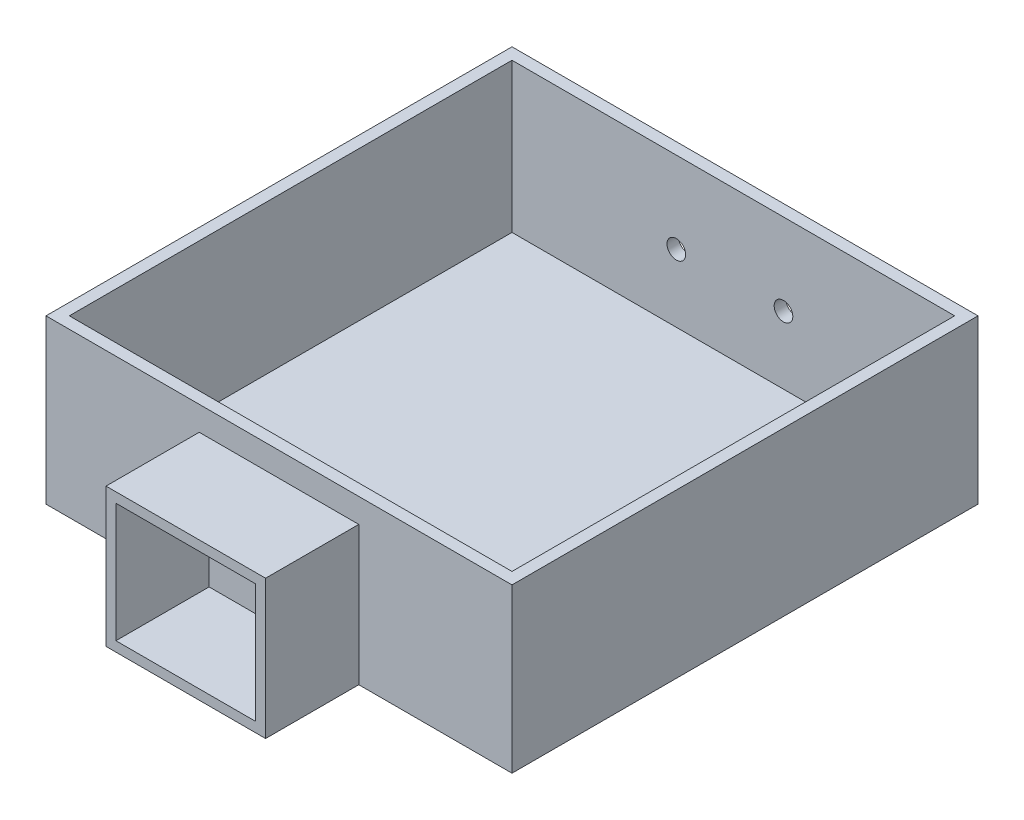
ISO-10303-21;
HEADER;
FILE_DESCRIPTION(('STEP AP214'),'2;1');
FILE_NAME('part.step','',(''),(''),'','','');
FILE_SCHEMA(('AUTOMOTIVE_DESIGN { 1 0 10303 214 1 1 1 1 }'));
ENDSEC;
DATA;
#1=APPLICATION_CONTEXT('core data for automotive mechanical design processes');
#2=APPLICATION_PROTOCOL_DEFINITION('international standard','automotive_design',2000,#1);
#3=PRODUCT_CONTEXT('',#1,'mechanical');
#4=PRODUCT('Part','Part','',(#3));
#5=PRODUCT_RELATED_PRODUCT_CATEGORY('part','',(#4));
#6=PRODUCT_DEFINITION_FORMATION('','',#4);
#7=PRODUCT_DEFINITION_CONTEXT('part definition',#1,'design');
#8=PRODUCT_DEFINITION('design','',#6,#7);
#9=PRODUCT_DEFINITION_SHAPE('','',#8);
#10=(LENGTH_UNIT() NAMED_UNIT(*) SI_UNIT(.MILLI.,.METRE.));
#11=(NAMED_UNIT(*) PLANE_ANGLE_UNIT() SI_UNIT($,.RADIAN.));
#12=(NAMED_UNIT(*) SI_UNIT($,.STERADIAN.) SOLID_ANGLE_UNIT());
#13=UNCERTAINTY_MEASURE_WITH_UNIT(LENGTH_MEASURE(1.E-05),#10,'distance_accuracy_value','');
#14=(GEOMETRIC_REPRESENTATION_CONTEXT(3) GLOBAL_UNCERTAINTY_ASSIGNED_CONTEXT((#13)) GLOBAL_UNIT_ASSIGNED_CONTEXT((#10,
#11,#12)) REPRESENTATION_CONTEXT('',''));
#15=CARTESIAN_POINT('',(0.,0.,0.));
#16=DIRECTION('',(0.,0.,1.));
#17=DIRECTION('',(1.,0.,0.));
#18=AXIS2_PLACEMENT_3D('',#15,#16,#17);
#19=CARTESIAN_POINT('',(-50.,35.,50.));
#20=DIRECTION('',(0.,0.,-1.));
#21=DIRECTION('',(-1.,0.,0.));
#22=AXIS2_PLACEMENT_3D('',#19,#20,#21);
#23=PLANE('',#22);
#24=DIRECTION('',(0.,1.,0.));
#25=VECTOR('',#24,1.);
#26=CARTESIAN_POINT('',(17.118009842931,0.,50.));
#27=LINE('',#26,#25);
#28=CARTESIAN_POINT('',(17.118009842931,0.,50.));
#29=VERTEX_POINT('',#28);
#30=CARTESIAN_POINT('',(17.118009842931,29.8003663542023,50.));
#31=VERTEX_POINT('',#30);
#32=EDGE_CURVE('E219',#29,#31,#27,.T.);
#33=ORIENTED_EDGE('',*,*,#32,.F.);
#34=DIRECTION('',(1.,0.,0.));
#35=VECTOR('',#34,1.);
#36=CARTESIAN_POINT('',(-50.,0.,50.));
#37=LINE('',#36,#35);
#38=CARTESIAN_POINT('',(50.,0.,50.));
#39=VERTEX_POINT('',#38);
#40=EDGE_CURVE('E335',#29,#39,#37,.T.);
#41=ORIENTED_EDGE('',*,*,#40,.T.);
#42=DIRECTION('',(0.,-1.,0.));
#43=VECTOR('',#42,1.);
#44=CARTESIAN_POINT('',(50.,35.,50.));
#45=LINE('',#44,#43);
#46=CARTESIAN_POINT('',(50.,35.,50.));
#47=VERTEX_POINT('',#46);
#48=EDGE_CURVE('E325',#47,#39,#45,.T.);
#49=ORIENTED_EDGE('',*,*,#48,.F.);
#50=DIRECTION('',(1.,0.,0.));
#51=VECTOR('',#50,1.);
#52=CARTESIAN_POINT('',(-50.,35.,50.));
#53=LINE('',#52,#51);
#54=CARTESIAN_POINT('',(-50.,35.,50.));
#55=VERTEX_POINT('',#54);
#56=EDGE_CURVE('E322',#55,#47,#53,.T.);
#57=ORIENTED_EDGE('',*,*,#56,.F.);
#58=DIRECTION('',(0.,-1.,0.));
#59=VECTOR('',#58,1.);
#60=CARTESIAN_POINT('',(-50.,35.,50.));
#61=LINE('',#60,#59);
#62=CARTESIAN_POINT('',(-50.,0.,50.));
#63=VERTEX_POINT('',#62);
#64=EDGE_CURVE('E341',#55,#63,#61,.T.);
#65=ORIENTED_EDGE('',*,*,#64,.T.);
#66=CARTESIAN_POINT('',(-17.118009842931,0.,50.));
#67=VERTEX_POINT('',#66);
#68=EDGE_CURVE('E316',#63,#67,#37,.T.);
#69=ORIENTED_EDGE('',*,*,#68,.T.);
#70=DIRECTION('',(0.,-1.,0.));
#71=VECTOR('',#70,1.);
#72=CARTESIAN_POINT('',(-17.118009842931,5.19963364579772,50.));
#73=LINE('',#72,#71);
#74=CARTESIAN_POINT('',(-17.118009842931,29.8003663542023,50.));
#75=VERTEX_POINT('',#74);
#76=EDGE_CURVE('E232',#75,#67,#73,.T.);
#77=ORIENTED_EDGE('',*,*,#76,.F.);
#78=DIRECTION('',(-1.,0.,0.));
#79=VECTOR('',#78,1.);
#80=CARTESIAN_POINT('',(-17.118009842931,29.8003663542023,50.));
#81=LINE('',#80,#79);
#82=EDGE_CURVE('E71',#31,#75,#81,.T.);
#83=ORIENTED_EDGE('',*,*,#82,.F.);
#84=EDGE_LOOP('',(#33,#41,#49,#57,#65,#69,#77,#83));
#85=FACE_BOUND('',#84,.T.);
#86=ADVANCED_FACE('F45',(#85),#23,.F.);
#87=CARTESIAN_POINT('',(50.,35.,50.));
#88=DIRECTION('',(-1.,0.,0.));
#89=DIRECTION('',(0.,0.,1.));
#90=AXIS2_PLACEMENT_3D('',#87,#88,#89);
#91=PLANE('',#90);
#92=DIRECTION('',(0.,0.,-1.));
#93=VECTOR('',#92,1.);
#94=CARTESIAN_POINT('',(50.,0.,50.));
#95=LINE('',#94,#93);
#96=CARTESIAN_POINT('',(50.,0.,-50.));
#97=VERTEX_POINT('',#96);
#98=EDGE_CURVE('E301',#39,#97,#95,.T.);
#99=ORIENTED_EDGE('',*,*,#98,.T.);
#100=DIRECTION('',(0.,-1.,0.));
#101=VECTOR('',#100,1.);
#102=CARTESIAN_POINT('',(50.,35.,-50.));
#103=LINE('',#102,#101);
#104=CARTESIAN_POINT('',(50.,35.,-50.));
#105=VERTEX_POINT('',#104);
#106=EDGE_CURVE('E11',#105,#97,#103,.T.);
#107=ORIENTED_EDGE('',*,*,#106,.F.);
#108=DIRECTION('',(0.,0.,-1.));
#109=VECTOR('',#108,1.);
#110=CARTESIAN_POINT('',(50.,35.,50.));
#111=LINE('',#110,#109);
#112=EDGE_CURVE('E311',#47,#105,#111,.T.);
#113=ORIENTED_EDGE('',*,*,#112,.F.);
#114=ORIENTED_EDGE('',*,*,#48,.T.);
#115=EDGE_LOOP('',(#99,#107,#113,#114));
#116=FACE_BOUND('',#115,.T.);
#117=ADVANCED_FACE('F47',(#116),#91,.F.);
#118=CARTESIAN_POINT('',(-50.,35.,-50.));
#119=DIRECTION('',(0.,0.,1.));
#120=DIRECTION('',(1.,0.,0.));
#121=AXIS2_PLACEMENT_3D('',#118,#119,#120);
#122=PLANE('',#121);
#123=CARTESIAN_POINT('',(10.7628205599326,17.5,-50.));
#124=DIRECTION('',(0.,0.,-1.));
#125=DIRECTION('',(-1.,0.,0.));
#126=AXIS2_PLACEMENT_3D('',#123,#124,#125);
#127=CIRCLE('',#126,2.);
#128=CARTESIAN_POINT('',(8.76282055993261,17.5,-50.));
#129=VERTEX_POINT('',#128);
#130=EDGE_CURVE('E254',#129,#129,#127,.T.);
#131=ORIENTED_EDGE('',*,*,#130,.F.);
#132=EDGE_LOOP('',(#131));
#133=FACE_BOUND('',#132,.T.);
#134=CARTESIAN_POINT('',(-12.2371794400674,17.5,-50.));
#135=DIRECTION('',(0.,0.,-1.));
#136=DIRECTION('',(-1.,0.,0.));
#137=AXIS2_PLACEMENT_3D('',#134,#135,#136);
#138=CIRCLE('',#137,2.);
#139=CARTESIAN_POINT('',(-14.2371794400674,17.5,-50.));
#140=VERTEX_POINT('',#139);
#141=EDGE_CURVE('E253',#140,#140,#138,.T.);
#142=ORIENTED_EDGE('',*,*,#141,.F.);
#143=EDGE_LOOP('',(#142));
#144=FACE_BOUND('',#143,.T.);
#145=DIRECTION('',(-1.,0.,0.));
#146=VECTOR('',#145,1.);
#147=CARTESIAN_POINT('',(-50.,0.,-50.));
#148=LINE('',#147,#146);
#149=CARTESIAN_POINT('',(-50.,0.,-50.));
#150=VERTEX_POINT('',#149);
#151=EDGE_CURVE('E329',#97,#150,#148,.T.);
#152=ORIENTED_EDGE('',*,*,#151,.T.);
#153=DIRECTION('',(0.,-1.,0.));
#154=VECTOR('',#153,1.);
#155=CARTESIAN_POINT('',(-50.,35.,-50.));
#156=LINE('',#155,#154);
#157=CARTESIAN_POINT('',(-50.,35.,-50.));
#158=VERTEX_POINT('',#157);
#159=EDGE_CURVE('E55',#158,#150,#156,.T.);
#160=ORIENTED_EDGE('',*,*,#159,.F.);
#161=DIRECTION('',(-1.,0.,0.));
#162=VECTOR('',#161,1.);
#163=CARTESIAN_POINT('',(-50.,35.,-50.));
#164=LINE('',#163,#162);
#165=EDGE_CURVE('E315',#105,#158,#164,.T.);
#166=ORIENTED_EDGE('',*,*,#165,.F.);
#167=ORIENTED_EDGE('',*,*,#106,.T.);
#168=EDGE_LOOP('',(#152,#160,#166,#167));
#169=FACE_BOUND('',#168,.T.);
#170=ADVANCED_FACE('F381',(#133,#144,#169),#122,.F.);
#171=CARTESIAN_POINT('',(-50.,35.,50.));
#172=DIRECTION('',(1.,0.,0.));
#173=DIRECTION('',(0.,0.,-1.));
#174=AXIS2_PLACEMENT_3D('',#171,#172,#173);
#175=PLANE('',#174);
#176=DIRECTION('',(0.,0.,1.));
#177=VECTOR('',#176,1.);
#178=CARTESIAN_POINT('',(-50.,0.,50.));
#179=LINE('',#178,#177);
#180=EDGE_CURVE('E332',#150,#63,#179,.T.);
#181=ORIENTED_EDGE('',*,*,#180,.T.);
#182=ORIENTED_EDGE('',*,*,#64,.F.);
#183=DIRECTION('',(0.,0.,1.));
#184=VECTOR('',#183,1.);
#185=CARTESIAN_POINT('',(-50.,35.,50.));
#186=LINE('',#185,#184);
#187=EDGE_CURVE('E319',#158,#55,#186,.T.);
#188=ORIENTED_EDGE('',*,*,#187,.F.);
#189=ORIENTED_EDGE('',*,*,#159,.T.);
#190=EDGE_LOOP('',(#181,#182,#188,#189));
#191=FACE_BOUND('',#190,.T.);
#192=ADVANCED_FACE('F387',(#191),#175,.F.);
#193=CARTESIAN_POINT('',(0.,35.,0.));
#194=DIRECTION('',(0.,-1.,0.));
#195=DIRECTION('',(0.,0.,-1.));
#196=AXIS2_PLACEMENT_3D('',#193,#194,#195);
#197=PLANE('',#196);
#198=DIRECTION('',(-1.,0.,0.));
#199=VECTOR('',#198,1.);
#200=CARTESIAN_POINT('',(-47.5,35.,-47.5));
#201=LINE('',#200,#199);
#202=CARTESIAN_POINT('',(47.5,35.,-47.5));
#203=VERTEX_POINT('',#202);
#204=CARTESIAN_POINT('',(-47.5,35.,-47.5));
#205=VERTEX_POINT('',#204);
#206=EDGE_CURVE('E286',#203,#205,#201,.T.);
#207=ORIENTED_EDGE('',*,*,#206,.F.);
#208=DIRECTION('',(0.,0.,-1.));
#209=VECTOR('',#208,1.);
#210=CARTESIAN_POINT('',(47.5,35.,47.5));
#211=LINE('',#210,#209);
#212=CARTESIAN_POINT('',(47.5,35.,47.5));
#213=VERTEX_POINT('',#212);
#214=EDGE_CURVE('E283',#213,#203,#211,.T.);
#215=ORIENTED_EDGE('',*,*,#214,.F.);
#216=DIRECTION('',(1.,0.,0.));
#217=VECTOR('',#216,1.);
#218=CARTESIAN_POINT('',(-47.5,35.,47.5));
#219=LINE('',#218,#217);
#220=CARTESIAN_POINT('',(-47.5,35.,47.5));
#221=VERTEX_POINT('',#220);
#222=EDGE_CURVE('E270',#221,#213,#219,.T.);
#223=ORIENTED_EDGE('',*,*,#222,.F.);
#224=DIRECTION('',(0.,0.,1.));
#225=VECTOR('',#224,1.);
#226=CARTESIAN_POINT('',(-47.5,35.,47.5));
#227=LINE('',#226,#225);
#228=EDGE_CURVE('E291',#205,#221,#227,.T.);
#229=ORIENTED_EDGE('',*,*,#228,.F.);
#230=EDGE_LOOP('',(#207,#215,#223,#229));
#231=FACE_BOUND('',#230,.T.);
#232=ORIENTED_EDGE('',*,*,#112,.T.);
#233=ORIENTED_EDGE('',*,*,#165,.T.);
#234=ORIENTED_EDGE('',*,*,#187,.T.);
#235=ORIENTED_EDGE('',*,*,#56,.T.);
#236=EDGE_LOOP('',(#232,#233,#234,#235));
#237=FACE_BOUND('',#236,.T.);
#238=ADVANCED_FACE('F389',(#231,#237),#197,.F.);
#239=CARTESIAN_POINT('',(0.,0.,0.));
#240=DIRECTION('',(0.,-1.,0.));
#241=DIRECTION('',(0.,0.,-1.));
#242=AXIS2_PLACEMENT_3D('',#239,#240,#241);
#243=PLANE('',#242);
#244=ORIENTED_EDGE('',*,*,#98,.F.);
#245=ORIENTED_EDGE('',*,*,#40,.F.);
#246=DIRECTION('',(0.,0.,-1.));
#247=VECTOR('',#246,1.);
#248=CARTESIAN_POINT('',(17.118009842931,0.,70.));
#249=LINE('',#248,#247);
#250=CARTESIAN_POINT('',(17.118009842931,0.,70.));
#251=VERTEX_POINT('',#250);
#252=EDGE_CURVE('E229',#251,#29,#249,.T.);
#253=ORIENTED_EDGE('',*,*,#252,.F.);
#254=DIRECTION('',(1.,0.,0.));
#255=VECTOR('',#254,1.);
#256=CARTESIAN_POINT('',(-17.118009842931,0.,70.));
#257=LINE('',#256,#255);
#258=CARTESIAN_POINT('',(-17.118009842931,0.,70.));
#259=VERTEX_POINT('',#258);
#260=EDGE_CURVE('E225',#259,#251,#257,.T.);
#261=ORIENTED_EDGE('',*,*,#260,.F.);
#262=DIRECTION('',(0.,0.,-1.));
#263=VECTOR('',#262,1.);
#264=CARTESIAN_POINT('',(-17.118009842931,0.,70.));
#265=LINE('',#264,#263);
#266=EDGE_CURVE('E241',#259,#67,#265,.T.);
#267=ORIENTED_EDGE('',*,*,#266,.T.);
#268=ORIENTED_EDGE('',*,*,#68,.F.);
#269=ORIENTED_EDGE('',*,*,#180,.F.);
#270=ORIENTED_EDGE('',*,*,#151,.F.);
#271=EDGE_LOOP('',(#244,#245,#253,#261,#267,#268,#269,#270));
#272=FACE_BOUND('',#271,.T.);
#273=ADVANCED_FACE('F385',(#272),#243,.T.);
#274=CARTESIAN_POINT('',(47.5,3.,47.5));
#275=DIRECTION('',(1.,0.,0.));
#276=DIRECTION('',(0.,0.,-1.));
#277=AXIS2_PLACEMENT_3D('',#274,#275,#276);
#278=PLANE('',#277);
#279=ORIENTED_EDGE('',*,*,#214,.T.);
#280=DIRECTION('',(0.,1.,0.));
#281=VECTOR('',#280,1.);
#282=CARTESIAN_POINT('',(47.5,3.,-47.5));
#283=LINE('',#282,#281);
#284=CARTESIAN_POINT('',(47.5,3.,-47.5));
#285=VERTEX_POINT('',#284);
#286=EDGE_CURVE('E282',#285,#203,#283,.T.);
#287=ORIENTED_EDGE('',*,*,#286,.F.);
#288=DIRECTION('',(0.,0.,-1.));
#289=VECTOR('',#288,1.);
#290=CARTESIAN_POINT('',(47.5,3.,47.5));
#291=LINE('',#290,#289);
#292=CARTESIAN_POINT('',(47.5,3.,47.5));
#293=VERTEX_POINT('',#292);
#294=EDGE_CURVE('E265',#293,#285,#291,.T.);
#295=ORIENTED_EDGE('',*,*,#294,.F.);
#296=DIRECTION('',(0.,1.,0.));
#297=VECTOR('',#296,1.);
#298=CARTESIAN_POINT('',(47.5,3.,47.5));
#299=LINE('',#298,#297);
#300=EDGE_CURVE('E298',#293,#213,#299,.T.);
#301=ORIENTED_EDGE('',*,*,#300,.T.);
#302=EDGE_LOOP('',(#279,#287,#295,#301));
#303=FACE_BOUND('',#302,.T.);
#304=ADVANCED_FACE('F431',(#303),#278,.F.);
#305=CARTESIAN_POINT('',(-47.5,3.,47.5));
#306=DIRECTION('',(0.,0.,1.));
#307=DIRECTION('',(1.,0.,0.));
#308=AXIS2_PLACEMENT_3D('',#305,#306,#307);
#309=PLANE('',#308);
#310=CARTESIAN_POINT('',(0.,17.5,47.5));
#311=DIRECTION('',(0.,0.,1.));
#312=DIRECTION('',(1.,0.,0.));
#313=AXIS2_PLACEMENT_3D('',#310,#311,#312);
#314=CIRCLE('',#313,10.);
#315=CARTESIAN_POINT('',(-10.,17.5,47.5));
#316=VERTEX_POINT('',#315);
#317=EDGE_CURVE('E287',#316,#316,#314,.F.);
#318=ORIENTED_EDGE('',*,*,#317,.F.);
#319=EDGE_LOOP('',(#318));
#320=FACE_BOUND('',#319,.T.);
#321=ORIENTED_EDGE('',*,*,#222,.T.);
#322=ORIENTED_EDGE('',*,*,#300,.F.);
#323=DIRECTION('',(1.,0.,0.));
#324=VECTOR('',#323,1.);
#325=CARTESIAN_POINT('',(-47.5,3.,47.5));
#326=LINE('',#325,#324);
#327=CARTESIAN_POINT('',(-47.5,3.,47.5));
#328=VERTEX_POINT('',#327);
#329=EDGE_CURVE('E278',#328,#293,#326,.T.);
#330=ORIENTED_EDGE('',*,*,#329,.F.);
#331=DIRECTION('',(0.,1.,0.));
#332=VECTOR('',#331,1.);
#333=CARTESIAN_POINT('',(-47.5,3.,47.5));
#334=LINE('',#333,#332);
#335=EDGE_CURVE('E302',#328,#221,#334,.T.);
#336=ORIENTED_EDGE('',*,*,#335,.T.);
#337=EDGE_LOOP('',(#321,#322,#330,#336));
#338=FACE_BOUND('',#337,.T.);
#339=ADVANCED_FACE('F435',(#320,#338),#309,.F.);
#340=CARTESIAN_POINT('',(-47.5,3.,47.5));
#341=DIRECTION('',(-1.,0.,0.));
#342=DIRECTION('',(0.,0.,1.));
#343=AXIS2_PLACEMENT_3D('',#340,#341,#342);
#344=PLANE('',#343);
#345=ORIENTED_EDGE('',*,*,#228,.T.);
#346=ORIENTED_EDGE('',*,*,#335,.F.);
#347=DIRECTION('',(0.,0.,1.));
#348=VECTOR('',#347,1.);
#349=CARTESIAN_POINT('',(-47.5,3.,47.5));
#350=LINE('',#349,#348);
#351=CARTESIAN_POINT('',(-47.5,3.,-47.5));
#352=VERTEX_POINT('',#351);
#353=EDGE_CURVE('E274',#352,#328,#350,.T.);
#354=ORIENTED_EDGE('',*,*,#353,.F.);
#355=DIRECTION('',(0.,1.,0.));
#356=VECTOR('',#355,1.);
#357=CARTESIAN_POINT('',(-47.5,3.,-47.5));
#358=LINE('',#357,#356);
#359=EDGE_CURVE('E305',#352,#205,#358,.T.);
#360=ORIENTED_EDGE('',*,*,#359,.T.);
#361=EDGE_LOOP('',(#345,#346,#354,#360));
#362=FACE_BOUND('',#361,.T.);
#363=ADVANCED_FACE('F439',(#362),#344,.F.);
#364=CARTESIAN_POINT('',(-47.5,3.,-47.5));
#365=DIRECTION('',(0.,0.,-1.));
#366=DIRECTION('',(-1.,0.,0.));
#367=AXIS2_PLACEMENT_3D('',#364,#365,#366);
#368=PLANE('',#367);
#369=CARTESIAN_POINT('',(10.7628205599326,17.5,-47.5));
#370=DIRECTION('',(0.,0.,-1.));
#371=DIRECTION('',(-1.,0.,0.));
#372=AXIS2_PLACEMENT_3D('',#369,#370,#371);
#373=CIRCLE('',#372,2.);
#374=CARTESIAN_POINT('',(8.76282055993261,17.5,-47.5));
#375=VERTEX_POINT('',#374);
#376=EDGE_CURVE('E49',#375,#375,#373,.T.);
#377=ORIENTED_EDGE('',*,*,#376,.T.);
#378=EDGE_LOOP('',(#377));
#379=FACE_BOUND('',#378,.T.);
#380=CARTESIAN_POINT('',(-12.2371794400674,17.5,-47.5));
#381=DIRECTION('',(0.,0.,-1.));
#382=DIRECTION('',(-1.,0.,0.));
#383=AXIS2_PLACEMENT_3D('',#380,#381,#382);
#384=CIRCLE('',#383,2.);
#385=CARTESIAN_POINT('',(-14.2371794400674,17.5,-47.5));
#386=VERTEX_POINT('',#385);
#387=EDGE_CURVE('E258',#386,#386,#384,.T.);
#388=ORIENTED_EDGE('',*,*,#387,.T.);
#389=EDGE_LOOP('',(#388));
#390=FACE_BOUND('',#389,.T.);
#391=ORIENTED_EDGE('',*,*,#206,.T.);
#392=ORIENTED_EDGE('',*,*,#359,.F.);
#393=DIRECTION('',(-1.,0.,0.));
#394=VECTOR('',#393,1.);
#395=CARTESIAN_POINT('',(-47.5,3.,-47.5));
#396=LINE('',#395,#394);
#397=EDGE_CURVE('E269',#285,#352,#396,.T.);
#398=ORIENTED_EDGE('',*,*,#397,.F.);
#399=ORIENTED_EDGE('',*,*,#286,.T.);
#400=EDGE_LOOP('',(#391,#392,#398,#399));
#401=FACE_BOUND('',#400,.T.);
#402=ADVANCED_FACE('F358',(#379,#390,#401),#368,.F.);
#403=CARTESIAN_POINT('',(0.,3.,0.));
#404=DIRECTION('',(0.,-1.,0.));
#405=DIRECTION('',(0.,0.,-1.));
#406=AXIS2_PLACEMENT_3D('',#403,#404,#405);
#407=PLANE('',#406);
#408=ORIENTED_EDGE('',*,*,#294,.T.);
#409=ORIENTED_EDGE('',*,*,#397,.T.);
#410=ORIENTED_EDGE('',*,*,#353,.T.);
#411=ORIENTED_EDGE('',*,*,#329,.T.);
#412=EDGE_LOOP('',(#408,#409,#410,#411));
#413=FACE_BOUND('',#412,.T.);
#414=ADVANCED_FACE('F438',(#413),#407,.F.);
#415=CARTESIAN_POINT('',(0.,17.5,50.000012));
#416=DIRECTION('',(0.,0.,-1.));
#417=DIRECTION('',(-1.,0.,0.));
#418=AXIS2_PLACEMENT_3D('',#415,#416,#417);
#419=CYLINDRICAL_SURFACE('',#418,10.);
#420=CARTESIAN_POINT('',(0.,17.5,50.));
#421=DIRECTION('',(0.,0.,-1.));
#422=DIRECTION('',(-1.,0.,0.));
#423=AXIS2_PLACEMENT_3D('',#420,#421,#422);
#424=CIRCLE('',#423,10.);
#425=CARTESIAN_POINT('',(-10.,17.5,50.));
#426=VERTEX_POINT('',#425);
#427=EDGE_CURVE('E208',#426,#426,#424,.F.);
#428=CARTESIAN_POINT('',(-10.,17.5,47.5));
#429=CARTESIAN_POINT('',(-10.,17.5,47.5260416666667));
#430=CARTESIAN_POINT('',(-10.,17.5,47.5520833333333));
#431=CARTESIAN_POINT('',(-10.,17.5,47.6041666666667));
#432=CARTESIAN_POINT('',(-10.,17.5,47.6302083333333));
#433=CARTESIAN_POINT('',(-10.,17.5,47.6822916666667));
#434=CARTESIAN_POINT('',(-10.,17.5,47.7083333333333));
#435=CARTESIAN_POINT('',(-10.,17.5,47.7604166666667));
#436=CARTESIAN_POINT('',(-10.,17.5,47.7864583333333));
#437=CARTESIAN_POINT('',(-10.,17.5,47.8385416666667));
#438=CARTESIAN_POINT('',(-10.,17.5,47.8645833333333));
#439=CARTESIAN_POINT('',(-10.,17.5,47.9166666666667));
#440=CARTESIAN_POINT('',(-10.,17.5,47.9427083333333));
#441=CARTESIAN_POINT('',(-10.,17.5,47.9947916666667));
#442=CARTESIAN_POINT('',(-10.,17.5,48.0208333333333));
#443=CARTESIAN_POINT('',(-10.,17.5,48.0729166666667));
#444=CARTESIAN_POINT('',(-10.,17.5,48.0989583333333));
#445=CARTESIAN_POINT('',(-10.,17.5,48.1510416666667));
#446=CARTESIAN_POINT('',(-10.,17.5,48.1770833333333));
#447=CARTESIAN_POINT('',(-10.,17.5,48.2291666666667));
#448=CARTESIAN_POINT('',(-10.,17.5,48.2552083333333));
#449=CARTESIAN_POINT('',(-10.,17.5,48.3072916666667));
#450=CARTESIAN_POINT('',(-10.,17.5,48.3333333333333));
#451=CARTESIAN_POINT('',(-10.,17.5,48.3854166666667));
#452=CARTESIAN_POINT('',(-10.,17.5,48.4114583333333));
#453=CARTESIAN_POINT('',(-10.,17.5,48.4635416666667));
#454=CARTESIAN_POINT('',(-10.,17.5,48.4895833333333));
#455=CARTESIAN_POINT('',(-10.,17.5,48.5416666666667));
#456=CARTESIAN_POINT('',(-10.,17.5,48.5677083333333));
#457=CARTESIAN_POINT('',(-10.,17.5,48.6197916666667));
#458=CARTESIAN_POINT('',(-10.,17.5,48.6458333333333));
#459=CARTESIAN_POINT('',(-10.,17.5,48.6979166666667));
#460=CARTESIAN_POINT('',(-10.,17.5,48.7239583333333));
#461=CARTESIAN_POINT('',(-10.,17.5,48.7760416666667));
#462=CARTESIAN_POINT('',(-10.,17.5,48.8020833333333));
#463=CARTESIAN_POINT('',(-10.,17.5,48.8541666666667));
#464=CARTESIAN_POINT('',(-10.,17.5,48.8802083333333));
#465=CARTESIAN_POINT('',(-10.,17.5,48.9322916666667));
#466=CARTESIAN_POINT('',(-10.,17.5,48.9583333333333));
#467=CARTESIAN_POINT('',(-10.,17.5,49.0104166666667));
#468=CARTESIAN_POINT('',(-10.,17.5,49.0364583333333));
#469=CARTESIAN_POINT('',(-10.,17.5,49.0885416666667));
#470=CARTESIAN_POINT('',(-10.,17.5,49.1145833333333));
#471=CARTESIAN_POINT('',(-10.,17.5,49.1666666666667));
#472=CARTESIAN_POINT('',(-10.,17.5,49.1927083333333));
#473=CARTESIAN_POINT('',(-10.,17.5,49.2447916666667));
#474=CARTESIAN_POINT('',(-10.,17.5,49.2708333333333));
#475=CARTESIAN_POINT('',(-10.,17.5,49.3229166666667));
#476=CARTESIAN_POINT('',(-10.,17.5,49.3489583333333));
#477=CARTESIAN_POINT('',(-10.,17.5,49.4010416666667));
#478=CARTESIAN_POINT('',(-10.,17.5,49.4270833333333));
#479=CARTESIAN_POINT('',(-10.,17.5,49.4791666666667));
#480=CARTESIAN_POINT('',(-10.,17.5,49.5052083333333));
#481=CARTESIAN_POINT('',(-10.,17.5,49.5572916666667));
#482=CARTESIAN_POINT('',(-10.,17.5,49.5833333333333));
#483=CARTESIAN_POINT('',(-10.,17.5,49.6354166666667));
#484=CARTESIAN_POINT('',(-10.,17.5,49.6614583333333));
#485=CARTESIAN_POINT('',(-10.,17.5,49.7135416666667));
#486=CARTESIAN_POINT('',(-10.,17.5,49.7395833333333));
#487=CARTESIAN_POINT('',(-10.,17.5,49.7916666666667));
#488=CARTESIAN_POINT('',(-10.,17.5,49.8177083333333));
#489=CARTESIAN_POINT('',(-10.,17.5,49.8697916666667));
#490=CARTESIAN_POINT('',(-10.,17.5,49.8958333333333));
#491=CARTESIAN_POINT('',(-10.,17.5,49.9479166666667));
#492=CARTESIAN_POINT('',(-10.,17.5,49.9739583333333));
#493=CARTESIAN_POINT('',(-10.,17.5,50.));
#494=B_SPLINE_CURVE_WITH_KNOTS('',3,(#428,#429,#430,#431,#432,#433,#434,#435,#436,#437,#438,
#439,#440,#441,#442,#443,#444,#445,#446,#447,#448,#449,#450,#451,#452,#453,#454,#455,#456,#457,
#458,#459,#460,#461,#462,#463,#464,#465,#466,#467,#468,#469,#470,#471,#472,#473,#474,#475,#476,
#477,#478,#479,#480,#481,#482,#483,#484,#485,#486,#487,#488,#489,#490,#491,#492,#493),
.UNSPECIFIED.,.F.,.F.,(4,2,2,2,2,2,2,2,2,2,2,2,2,2,2,2,2,2,2,2,2,2,2,2,2,2,2,2,2,2,2,2,4),(0.,
0.0781250000000053,0.156250000000004,0.234375000000002,0.3125,0.390625000000006,
0.468750000000004,0.546875000000002,0.625000000000001,0.703125000000006,0.781250000000004,
0.859375000000002,0.937500000000001,1.01562500000001,1.09375,1.171875,1.25,1.32812500000001,
1.40625,1.484375,1.5625,1.64062500000001,1.71875,1.796875,1.875,1.95312500000001,
2.03125000000001,2.109375,2.18750000000001,2.26562500000001,2.34375000000001,2.421875,
2.50000000000001),.UNSPECIFIED.);
#495=EDGE_CURVE('BSEAM372',#316,#426,#494,.T.);
#496=ORIENTED_EDGE('',*,*,#317,.T.);
#497=ORIENTED_EDGE('',*,*,#427,.T.);
#498=ORIENTED_EDGE('',*,*,#495,.T.);
#499=ORIENTED_EDGE('',*,*,#495,.F.);
#500=EDGE_LOOP('',(#496,#498,#497,#499));
#501=FACE_BOUND('',#500,.T.);
#502=ADVANCED_FACE('F372',(#501),#419,.F.);
#503=CARTESIAN_POINT('',(-12.2371794400674,17.5,-18.));
#504=DIRECTION('',(0.,0.,-1.));
#505=DIRECTION('',(-1.,0.,0.));
#506=AXIS2_PLACEMENT_3D('',#503,#504,#505);
#507=CYLINDRICAL_SURFACE('',#506,2.);
#508=ORIENTED_EDGE('',*,*,#141,.T.);
#509=EDGE_LOOP('',(#508));
#510=FACE_BOUND('',#509,.T.);
#511=ORIENTED_EDGE('',*,*,#387,.F.);
#512=EDGE_LOOP('',(#511));
#513=FACE_BOUND('',#512,.T.);
#514=ADVANCED_FACE('F362',(#510,#513),#507,.F.);
#515=CARTESIAN_POINT('',(10.7628205599326,17.5,-18.));
#516=DIRECTION('',(0.,0.,-1.));
#517=DIRECTION('',(-1.,0.,0.));
#518=AXIS2_PLACEMENT_3D('',#515,#516,#517);
#519=CYLINDRICAL_SURFACE('',#518,2.);
#520=ORIENTED_EDGE('',*,*,#130,.T.);
#521=EDGE_LOOP('',(#520));
#522=FACE_BOUND('',#521,.T.);
#523=ORIENTED_EDGE('',*,*,#376,.F.);
#524=EDGE_LOOP('',(#523));
#525=FACE_BOUND('',#524,.T.);
#526=ADVANCED_FACE('F360',(#522,#525),#519,.F.);
#527=CARTESIAN_POINT('',(0.,0.,70.));
#528=DIRECTION('',(0.,0.,-1.));
#529=DIRECTION('',(-1.,0.,0.));
#530=AXIS2_PLACEMENT_3D('',#527,#528,#529);
#531=PLANE('',#530);
#532=DIRECTION('',(0.,1.,0.));
#533=VECTOR('',#532,1.);
#534=CARTESIAN_POINT('',(-14.9966894993714,2.12132034355962,70.));
#535=LINE('',#534,#533);
#536=CARTESIAN_POINT('',(-14.9966894993714,2.12132034355962,70.));
#537=VERTEX_POINT('',#536);
#538=CARTESIAN_POINT('',(-14.9966894993714,27.6790460106426,70.));
#539=VERTEX_POINT('',#538);
#540=EDGE_CURVE('E174',#537,#539,#535,.T.);
#541=ORIENTED_EDGE('',*,*,#540,.T.);
#542=DIRECTION('',(1.,0.,0.));
#543=VECTOR('',#542,1.);
#544=CARTESIAN_POINT('',(-14.9966894993714,27.6790460106426,70.));
#545=LINE('',#544,#543);
#546=CARTESIAN_POINT('',(14.9966894993714,27.6790460106426,70.));
#547=VERTEX_POINT('',#546);
#548=EDGE_CURVE('E165',#539,#547,#545,.T.);
#549=ORIENTED_EDGE('',*,*,#548,.T.);
#550=DIRECTION('',(0.,-1.,0.));
#551=VECTOR('',#550,1.);
#552=CARTESIAN_POINT('',(14.9966894993714,2.12132034355968,70.));
#553=LINE('',#552,#551);
#554=CARTESIAN_POINT('',(14.9966894993714,2.12132034355968,70.));
#555=VERTEX_POINT('',#554);
#556=EDGE_CURVE('E177',#547,#555,#553,.T.);
#557=ORIENTED_EDGE('',*,*,#556,.T.);
#558=DIRECTION('',(-1.,0.,0.));
#559=VECTOR('',#558,1.);
#560=CARTESIAN_POINT('',(-14.9966894993714,2.12132034355962,70.));
#561=LINE('',#560,#559);
#562=EDGE_CURVE('E63',#555,#537,#561,.T.);
#563=ORIENTED_EDGE('',*,*,#562,.T.);
#564=EDGE_LOOP('',(#541,#549,#557,#563));
#565=FACE_BOUND('',#564,.T.);
#566=DIRECTION('',(0.,1.,0.));
#567=VECTOR('',#566,1.);
#568=CARTESIAN_POINT('',(17.118009842931,5.19963364579772,70.));
#569=LINE('',#568,#567);
#570=CARTESIAN_POINT('',(17.118009842931,29.8003663542023,70.));
#571=VERTEX_POINT('',#570);
#572=EDGE_CURVE('E214',#251,#571,#569,.T.);
#573=ORIENTED_EDGE('',*,*,#572,.T.);
#574=DIRECTION('',(-1.,0.,0.));
#575=VECTOR('',#574,1.);
#576=CARTESIAN_POINT('',(-17.118009842931,29.8003663542023,70.));
#577=LINE('',#576,#575);
#578=CARTESIAN_POINT('',(-17.118009842931,29.8003663542023,70.));
#579=VERTEX_POINT('',#578);
#580=EDGE_CURVE('E218',#571,#579,#577,.T.);
#581=ORIENTED_EDGE('',*,*,#580,.T.);
#582=DIRECTION('',(0.,-1.,0.));
#583=VECTOR('',#582,1.);
#584=CARTESIAN_POINT('',(-17.118009842931,5.19963364579772,70.));
#585=LINE('',#584,#583);
#586=EDGE_CURVE('E222',#579,#259,#585,.T.);
#587=ORIENTED_EDGE('',*,*,#586,.T.);
#588=ORIENTED_EDGE('',*,*,#260,.T.);
#589=EDGE_LOOP('',(#573,#581,#587,#588));
#590=FACE_BOUND('',#589,.T.);
#591=ADVANCED_FACE('F182',(#565,#590),#531,.F.);
#592=CARTESIAN_POINT('',(17.118009842931,0.,70.));
#593=DIRECTION('',(-1.,0.,0.));
#594=DIRECTION('',(0.,-1.,0.));
#595=AXIS2_PLACEMENT_3D('',#592,#593,#594);
#596=PLANE('',#595);
#597=ORIENTED_EDGE('',*,*,#32,.T.);
#598=DIRECTION('',(0.,0.,-1.));
#599=VECTOR('',#598,1.);
#600=CARTESIAN_POINT('',(17.118009842931,29.8003663542023,70.));
#601=LINE('',#600,#599);
#602=EDGE_CURVE('E249',#571,#31,#601,.T.);
#603=ORIENTED_EDGE('',*,*,#602,.F.);
#604=ORIENTED_EDGE('',*,*,#572,.F.);
#605=ORIENTED_EDGE('',*,*,#252,.T.);
#606=EDGE_LOOP('',(#597,#603,#604,#605));
#607=FACE_BOUND('',#606,.T.);
#608=ADVANCED_FACE('F370',(#607),#596,.F.);
#609=CARTESIAN_POINT('',(-17.118009842931,5.19963364579772,70.));
#610=DIRECTION('',(1.,0.,0.));
#611=DIRECTION('',(0.,0.,-1.));
#612=AXIS2_PLACEMENT_3D('',#609,#610,#611);
#613=PLANE('',#612);
#614=ORIENTED_EDGE('',*,*,#76,.T.);
#615=ORIENTED_EDGE('',*,*,#266,.F.);
#616=ORIENTED_EDGE('',*,*,#586,.F.);
#617=DIRECTION('',(0.,0.,-1.));
#618=VECTOR('',#617,1.);
#619=CARTESIAN_POINT('',(-17.118009842931,29.8003663542023,70.));
#620=LINE('',#619,#618);
#621=EDGE_CURVE('E245',#579,#75,#620,.T.);
#622=ORIENTED_EDGE('',*,*,#621,.T.);
#623=EDGE_LOOP('',(#614,#615,#616,#622));
#624=FACE_BOUND('',#623,.T.);
#625=ADVANCED_FACE('F413',(#624),#613,.F.);
#626=CARTESIAN_POINT('',(-17.118009842931,29.8003663542023,70.));
#627=DIRECTION('',(0.,-1.,0.));
#628=DIRECTION('',(0.,0.,-1.));
#629=AXIS2_PLACEMENT_3D('',#626,#627,#628);
#630=PLANE('',#629);
#631=ORIENTED_EDGE('',*,*,#82,.T.);
#632=ORIENTED_EDGE('',*,*,#621,.F.);
#633=ORIENTED_EDGE('',*,*,#580,.F.);
#634=ORIENTED_EDGE('',*,*,#602,.T.);
#635=EDGE_LOOP('',(#631,#632,#633,#634));
#636=FACE_BOUND('',#635,.T.);
#637=ADVANCED_FACE('F417',(#636),#630,.F.);
#638=CARTESIAN_POINT('',(-14.9966894993714,27.6790460106426,70.));
#639=DIRECTION('',(0.,1.,0.));
#640=DIRECTION('',(0.,0.,1.));
#641=AXIS2_PLACEMENT_3D('',#638,#639,#640);
#642=PLANE('',#641);
#643=DIRECTION('',(1.,0.,0.));
#644=VECTOR('',#643,1.);
#645=CARTESIAN_POINT('',(-14.9966894993714,27.6790460106426,50.));
#646=LINE('',#645,#644);
#647=CARTESIAN_POINT('',(-14.9966894993714,27.6790460106426,50.));
#648=VERTEX_POINT('',#647);
#649=CARTESIAN_POINT('',(14.9966894993714,27.6790460106426,50.));
#650=VERTEX_POINT('',#649);
#651=EDGE_CURVE('E168',#648,#650,#646,.T.);
#652=ORIENTED_EDGE('',*,*,#651,.T.);
#653=DIRECTION('',(0.,0.,-1.));
#654=VECTOR('',#653,1.);
#655=CARTESIAN_POINT('',(14.9966894993714,27.6790460106426,70.));
#656=LINE('',#655,#654);
#657=EDGE_CURVE('E161',#547,#650,#656,.T.);
#658=ORIENTED_EDGE('',*,*,#657,.F.);
#659=ORIENTED_EDGE('',*,*,#548,.F.);
#660=DIRECTION('',(0.,0.,-1.));
#661=VECTOR('',#660,1.);
#662=CARTESIAN_POINT('',(-14.9966894993714,27.6790460106426,70.));
#663=LINE('',#662,#661);
#664=EDGE_CURVE('E205',#539,#648,#663,.T.);
#665=ORIENTED_EDGE('',*,*,#664,.T.);
#666=EDGE_LOOP('',(#652,#658,#659,#665));
#667=FACE_BOUND('',#666,.T.);
#668=ADVANCED_FACE('F163',(#667),#642,.F.);
#669=CARTESIAN_POINT('',(-14.9966894993714,2.12132034355962,70.));
#670=DIRECTION('',(-1.,0.,0.));
#671=DIRECTION('',(0.,0.,1.));
#672=AXIS2_PLACEMENT_3D('',#669,#670,#671);
#673=PLANE('',#672);
#674=DIRECTION('',(0.,1.,0.));
#675=VECTOR('',#674,1.);
#676=CARTESIAN_POINT('',(-14.9966894993714,2.12132034355962,50.));
#677=LINE('',#676,#675);
#678=CARTESIAN_POINT('',(-14.9966894993714,2.12132034355962,50.));
#679=VERTEX_POINT('',#678);
#680=EDGE_CURVE('E186',#679,#648,#677,.T.);
#681=ORIENTED_EDGE('',*,*,#680,.T.);
#682=ORIENTED_EDGE('',*,*,#664,.F.);
#683=ORIENTED_EDGE('',*,*,#540,.F.);
#684=DIRECTION('',(0.,0.,-1.));
#685=VECTOR('',#684,1.);
#686=CARTESIAN_POINT('',(-14.9966894993714,2.12132034355962,70.));
#687=LINE('',#686,#685);
#688=EDGE_CURVE('E209',#537,#679,#687,.T.);
#689=ORIENTED_EDGE('',*,*,#688,.T.);
#690=EDGE_LOOP('',(#681,#682,#683,#689));
#691=FACE_BOUND('',#690,.T.);
#692=ADVANCED_FACE('F463',(#691),#673,.F.);
#693=CARTESIAN_POINT('',(-14.9966894993714,2.12132034355962,70.));
#694=DIRECTION('',(0.,-1.,0.));
#695=DIRECTION('',(1.,0.,0.));
#696=AXIS2_PLACEMENT_3D('',#693,#694,#695);
#697=PLANE('',#696);
#698=DIRECTION('',(-1.,0.,0.));
#699=VECTOR('',#698,1.);
#700=CARTESIAN_POINT('',(-14.9966894993714,2.12132034355962,50.));
#701=LINE('',#700,#699);
#702=CARTESIAN_POINT('',(14.9966894993714,2.12132034355968,50.));
#703=VERTEX_POINT('',#702);
#704=EDGE_CURVE('E190',#703,#679,#701,.T.);
#705=ORIENTED_EDGE('',*,*,#704,.T.);
#706=ORIENTED_EDGE('',*,*,#688,.F.);
#707=ORIENTED_EDGE('',*,*,#562,.F.);
#708=DIRECTION('',(0.,0.,-1.));
#709=VECTOR('',#708,1.);
#710=CARTESIAN_POINT('',(14.9966894993714,2.12132034355968,70.));
#711=LINE('',#710,#709);
#712=EDGE_CURVE('E173',#555,#703,#711,.T.);
#713=ORIENTED_EDGE('',*,*,#712,.T.);
#714=EDGE_LOOP('',(#705,#706,#707,#713));
#715=FACE_BOUND('',#714,.T.);
#716=ADVANCED_FACE('F464',(#715),#697,.F.);
#717=CARTESIAN_POINT('',(14.9966894993714,2.12132034355968,70.));
#718=DIRECTION('',(1.,0.,0.));
#719=DIRECTION('',(0.,0.,-1.));
#720=AXIS2_PLACEMENT_3D('',#717,#718,#719);
#721=PLANE('',#720);
#722=DIRECTION('',(0.,-1.,0.));
#723=VECTOR('',#722,1.);
#724=CARTESIAN_POINT('',(14.9966894993714,2.12132034355968,50.));
#725=LINE('',#724,#723);
#726=EDGE_CURVE('E199',#650,#703,#725,.T.);
#727=ORIENTED_EDGE('',*,*,#726,.T.);
#728=ORIENTED_EDGE('',*,*,#712,.F.);
#729=ORIENTED_EDGE('',*,*,#556,.F.);
#730=ORIENTED_EDGE('',*,*,#657,.T.);
#731=EDGE_LOOP('',(#727,#728,#729,#730));
#732=FACE_BOUND('',#731,.T.);
#733=ADVANCED_FACE('F178',(#732),#721,.F.);
#734=CARTESIAN_POINT('',(0.,0.,50.));
#735=DIRECTION('',(0.,0.,1.));
#736=DIRECTION('',(1.,0.,0.));
#737=AXIS2_PLACEMENT_3D('',#734,#735,#736);
#738=PLANE('',#737);
#739=ORIENTED_EDGE('',*,*,#427,.F.);
#740=EDGE_LOOP('',(#739));
#741=FACE_BOUND('',#740,.T.);
#742=ORIENTED_EDGE('',*,*,#651,.F.);
#743=ORIENTED_EDGE('',*,*,#680,.F.);
#744=ORIENTED_EDGE('',*,*,#704,.F.);
#745=ORIENTED_EDGE('',*,*,#726,.F.);
#746=EDGE_LOOP('',(#742,#743,#744,#745));
#747=FACE_BOUND('',#746,.T.);
#748=ADVANCED_FACE('F456',(#741,#747),#738,.T.);
#749=CLOSED_SHELL('',(#86,#117,#170,#192,#238,#273,#304,#339,#363,#402,#414,#502,#514,#526,#591,
#608,#625,#637,#668,#692,#716,#733,#748));
#750=MANIFOLD_SOLID_BREP('B2',#749);
#751=ADVANCED_BREP_SHAPE_REPRESENTATION('',(#18,#750),#14);
#752=SHAPE_DEFINITION_REPRESENTATION(#9,#751);
ENDSEC;
END-ISO-10303-21;
